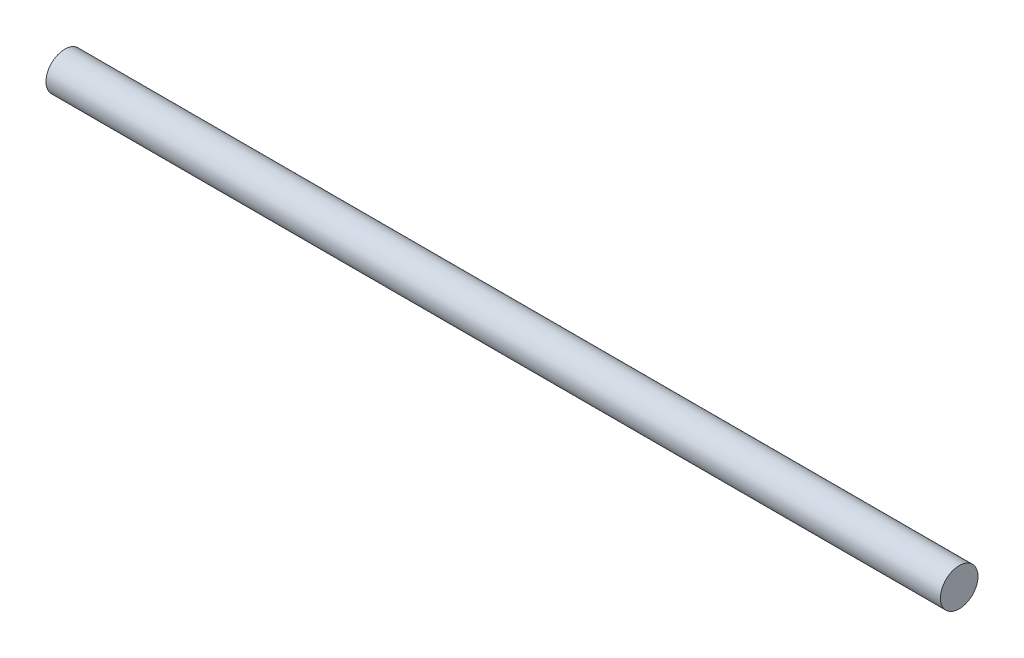
ISO-10303-21;
HEADER;
FILE_DESCRIPTION(('STEP AP214'),'2;1');
FILE_NAME('part.step','',(''),(''),'','','');
FILE_SCHEMA(('AUTOMOTIVE_DESIGN { 1 0 10303 214 1 1 1 1 }'));
ENDSEC;
DATA;
#1=APPLICATION_CONTEXT('core data for automotive mechanical design processes');
#2=APPLICATION_PROTOCOL_DEFINITION('international standard','automotive_design',2000,#1);
#3=PRODUCT_CONTEXT('',#1,'mechanical');
#4=PRODUCT('Part','Part','',(#3));
#5=PRODUCT_RELATED_PRODUCT_CATEGORY('part','',(#4));
#6=PRODUCT_DEFINITION_FORMATION('','',#4);
#7=PRODUCT_DEFINITION_CONTEXT('part definition',#1,'design');
#8=PRODUCT_DEFINITION('design','',#6,#7);
#9=PRODUCT_DEFINITION_SHAPE('','',#8);
#10=(LENGTH_UNIT() NAMED_UNIT(*) SI_UNIT(.MILLI.,.METRE.));
#11=(NAMED_UNIT(*) PLANE_ANGLE_UNIT() SI_UNIT($,.RADIAN.));
#12=(NAMED_UNIT(*) SI_UNIT($,.STERADIAN.) SOLID_ANGLE_UNIT());
#13=UNCERTAINTY_MEASURE_WITH_UNIT(LENGTH_MEASURE(1.E-05),#10,'distance_accuracy_value','');
#14=(GEOMETRIC_REPRESENTATION_CONTEXT(3) GLOBAL_UNCERTAINTY_ASSIGNED_CONTEXT((#13)) GLOBAL_UNIT_ASSIGNED_CONTEXT((#10,
#11,#12)) REPRESENTATION_CONTEXT('',''));
#15=CARTESIAN_POINT('',(0.,0.,0.));
#16=DIRECTION('',(0.,0.,1.));
#17=DIRECTION('',(1.,0.,0.));
#18=AXIS2_PLACEMENT_3D('',#15,#16,#17);
#19=CARTESIAN_POINT('',(59.5,0.,0.));
#20=DIRECTION('',(-1.,0.,0.));
#21=DIRECTION('',(0.,0.,1.));
#22=AXIS2_PLACEMENT_3D('',#19,#20,#21);
#23=CYLINDRICAL_SURFACE('',#22,1.25);
#24=CARTESIAN_POINT('',(59.5,0.,0.));
#25=DIRECTION('',(1.,0.,0.));
#26=DIRECTION('',(0.,0.,-1.));
#27=AXIS2_PLACEMENT_3D('',#24,#25,#26);
#28=CIRCLE('',#27,1.25);
#29=CARTESIAN_POINT('',(59.5,0.,-1.25));
#30=VERTEX_POINT('',#29);
#31=EDGE_CURVE('E10',#30,#30,#28,.T.);
#32=ORIENTED_EDGE('',*,*,#31,.F.);
#33=EDGE_LOOP('',(#32));
#34=FACE_BOUND('',#33,.T.);
#35=CARTESIAN_POINT('',(0.,0.,0.));
#36=DIRECTION('',(1.,0.,0.));
#37=DIRECTION('',(0.,0.,-1.));
#38=AXIS2_PLACEMENT_3D('',#35,#36,#37);
#39=CIRCLE('',#38,1.25);
#40=CARTESIAN_POINT('',(0.,0.,-1.25));
#41=VERTEX_POINT('',#40);
#42=EDGE_CURVE('E44',#41,#41,#39,.T.);
#43=ORIENTED_EDGE('',*,*,#42,.T.);
#44=EDGE_LOOP('',(#43));
#45=FACE_BOUND('',#44,.T.);
#46=ADVANCED_FACE('F41',(#34,#45),#23,.T.);
#47=CARTESIAN_POINT('',(59.5,0.,0.));
#48=DIRECTION('',(1.,0.,0.));
#49=DIRECTION('',(0.,0.,-1.));
#50=AXIS2_PLACEMENT_3D('',#47,#48,#49);
#51=PLANE('',#50);
#52=ORIENTED_EDGE('',*,*,#31,.T.);
#53=EDGE_LOOP('',(#52));
#54=FACE_BOUND('',#53,.T.);
#55=ADVANCED_FACE('F58',(#54),#51,.T.);
#56=CARTESIAN_POINT('',(0.,0.,0.));
#57=DIRECTION('',(1.,0.,0.));
#58=DIRECTION('',(0.,0.,-1.));
#59=AXIS2_PLACEMENT_3D('',#56,#57,#58);
#60=PLANE('',#59);
#61=ORIENTED_EDGE('',*,*,#42,.F.);
#62=EDGE_LOOP('',(#61));
#63=FACE_BOUND('',#62,.T.);
#64=ADVANCED_FACE('F56',(#63),#60,.F.);
#65=CLOSED_SHELL('',(#46,#55,#64));
#66=MANIFOLD_SOLID_BREP('B2',#65);
#67=ADVANCED_BREP_SHAPE_REPRESENTATION('',(#18,#66),#14);
#68=SHAPE_DEFINITION_REPRESENTATION(#9,#67);
ENDSEC;
END-ISO-10303-21;
